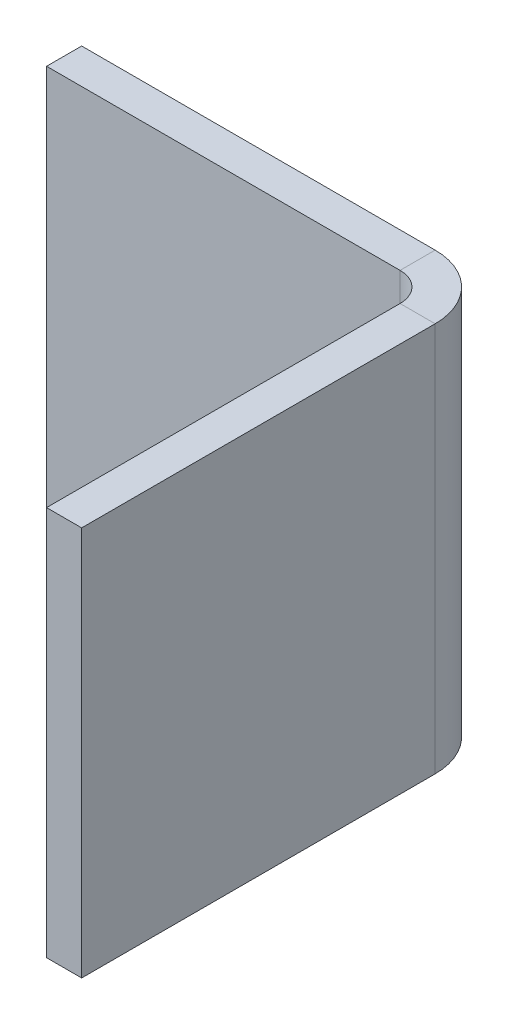
ISO-10303-21;
HEADER;
FILE_DESCRIPTION(('STEP AP214'),'2;1');
FILE_NAME('part.step','',(''),(''),'','','');
FILE_SCHEMA(('AUTOMOTIVE_DESIGN { 1 0 10303 214 1 1 1 1 }'));
ENDSEC;
DATA;
#1=APPLICATION_CONTEXT('core data for automotive mechanical design processes');
#2=APPLICATION_PROTOCOL_DEFINITION('international standard','automotive_design',2000,#1);
#3=PRODUCT_CONTEXT('',#1,'mechanical');
#4=PRODUCT('Part','Part','',(#3));
#5=PRODUCT_RELATED_PRODUCT_CATEGORY('part','',(#4));
#6=PRODUCT_DEFINITION_FORMATION('','',#4);
#7=PRODUCT_DEFINITION_CONTEXT('part definition',#1,'design');
#8=PRODUCT_DEFINITION('design','',#6,#7);
#9=PRODUCT_DEFINITION_SHAPE('','',#8);
#10=(LENGTH_UNIT() NAMED_UNIT(*) SI_UNIT(.MILLI.,.METRE.));
#11=(NAMED_UNIT(*) PLANE_ANGLE_UNIT() SI_UNIT($,.RADIAN.));
#12=(NAMED_UNIT(*) SI_UNIT($,.STERADIAN.) SOLID_ANGLE_UNIT());
#13=UNCERTAINTY_MEASURE_WITH_UNIT(LENGTH_MEASURE(1.E-05),#10,'distance_accuracy_value','');
#14=(GEOMETRIC_REPRESENTATION_CONTEXT(3) GLOBAL_UNCERTAINTY_ASSIGNED_CONTEXT((#13)) GLOBAL_UNIT_ASSIGNED_CONTEXT((#10,
#11,#12)) REPRESENTATION_CONTEXT('',''));
#15=CARTESIAN_POINT('',(0.,0.,0.));
#16=DIRECTION('',(0.,0.,1.));
#17=DIRECTION('',(1.,0.,0.));
#18=AXIS2_PLACEMENT_3D('',#15,#16,#17);
#19=CARTESIAN_POINT('',(3.64456070240273,0.,-2.68526762377754));
#20=DIRECTION('',(-1.,0.,0.));
#21=DIRECTION('',(0.,0.,1.));
#22=AXIS2_PLACEMENT_3D('',#19,#20,#21);
#23=PLANE('',#22);
#24=DIRECTION('',(0.,0.,1.));
#25=VECTOR('',#24,1.);
#26=CARTESIAN_POINT('',(3.64456070240275,-4.93562231759657,-9.74535346068741));
#27=LINE('',#26,#25);
#28=CARTESIAN_POINT('',(3.64456070240271,-4.93562231759657,1.18660000000001));
#29=VERTEX_POINT('',#28);
#30=CARTESIAN_POINT('',(3.64456070240268,-4.93562231759657,10.2546465393126));
#31=VERTEX_POINT('',#30);
#32=EDGE_CURVE('E47',#29,#31,#27,.T.);
#33=ORIENTED_EDGE('',*,*,#32,.F.);
#34=DIRECTION('',(0.,1.,0.));
#35=VECTOR('',#34,1.);
#36=CARTESIAN_POINT('',(3.64456070240271,0.,1.18660000000001));
#37=LINE('',#36,#35);
#38=CARTESIAN_POINT('',(3.64456070240271,5.06437768240343,1.18660000000001));
#39=VERTEX_POINT('',#38);
#40=EDGE_CURVE('E134',#29,#39,#37,.T.);
#41=ORIENTED_EDGE('',*,*,#40,.T.);
#42=DIRECTION('',(0.,0.,-1.));
#43=VECTOR('',#42,1.);
#44=CARTESIAN_POINT('',(3.64456070240275,5.06437768240343,-9.74535346068741));
#45=LINE('',#44,#43);
#46=CARTESIAN_POINT('',(3.64456070240268,5.06437768240343,10.2546465393126));
#47=VERTEX_POINT('',#46);
#48=EDGE_CURVE('E158',#47,#39,#45,.T.);
#49=ORIENTED_EDGE('',*,*,#48,.F.);
#50=DIRECTION('',(0.,1.,0.));
#51=VECTOR('',#50,1.);
#52=CARTESIAN_POINT('',(3.64456070240268,5.06437768240343,10.2546465393126));
#53=LINE('',#52,#51);
#54=EDGE_CURVE('E155',#31,#47,#53,.T.);
#55=ORIENTED_EDGE('',*,*,#54,.F.);
#56=EDGE_LOOP('',(#33,#41,#49,#55));
#57=FACE_BOUND('',#56,.T.);
#58=ADVANCED_FACE('F43',(#57),#23,.F.);
#59=CARTESIAN_POINT('',(3.64456070240275,5.06437768240343,-9.74535346068741));
#60=DIRECTION('',(0.,1.,0.));
#61=DIRECTION('',(-1.,0.,0.));
#62=AXIS2_PLACEMENT_3D('',#59,#60,#61);
#63=PLANE('',#62);
#64=DIRECTION('',(1.,0.,0.));
#65=VECTOR('',#64,1.);
#66=CARTESIAN_POINT('',(3.64456070240271,5.06437768240343,1.18660000000001));
#67=LINE('',#66,#65);
#68=CARTESIAN_POINT('',(2.74456070240271,5.06437768240343,1.1866));
#69=VERTEX_POINT('',#68);
#70=EDGE_CURVE('E12',#69,#39,#67,.T.);
#71=ORIENTED_EDGE('',*,*,#70,.F.);
#72=DIRECTION('',(0.,0.,-1.));
#73=VECTOR('',#72,1.);
#74=CARTESIAN_POINT('',(2.74456070240275,5.06437768240343,-9.74535346068741));
#75=LINE('',#74,#73);
#76=CARTESIAN_POINT('',(2.74456070240268,5.06437768240343,10.2546465393126));
#77=VERTEX_POINT('',#76);
#78=EDGE_CURVE('E60',#77,#69,#75,.T.);
#79=ORIENTED_EDGE('',*,*,#78,.F.);
#80=DIRECTION('',(-1.,0.,0.));
#81=VECTOR('',#80,1.);
#82=CARTESIAN_POINT('',(3.64456070240268,5.06437768240343,10.2546465393126));
#83=LINE('',#82,#81);
#84=EDGE_CURVE('E161',#47,#77,#83,.T.);
#85=ORIENTED_EDGE('',*,*,#84,.F.);
#86=ORIENTED_EDGE('',*,*,#48,.T.);
#87=EDGE_LOOP('',(#71,#79,#85,#86));
#88=FACE_BOUND('',#87,.T.);
#89=ADVANCED_FACE('F45',(#88),#63,.T.);
#90=CARTESIAN_POINT('',(3.64456070240268,5.06437768240343,10.2546465393126));
#91=DIRECTION('',(0.,0.,1.));
#92=DIRECTION('',(1.,0.,0.));
#93=AXIS2_PLACEMENT_3D('',#90,#91,#92);
#94=PLANE('',#93);
#95=DIRECTION('',(0.,1.,0.));
#96=VECTOR('',#95,1.);
#97=CARTESIAN_POINT('',(2.74456070240268,5.06437768240343,10.2546465393126));
#98=LINE('',#97,#96);
#99=CARTESIAN_POINT('',(2.74456070240268,-4.93562231759657,10.2546465393126));
#100=VERTEX_POINT('',#99);
#101=EDGE_CURVE('E159',#100,#77,#98,.T.);
#102=ORIENTED_EDGE('',*,*,#101,.F.);
#103=DIRECTION('',(-1.,0.,0.));
#104=VECTOR('',#103,1.);
#105=CARTESIAN_POINT('',(3.64456070240268,-4.93562231759657,10.2546465393126));
#106=LINE('',#105,#104);
#107=EDGE_CURVE('E163',#31,#100,#106,.T.);
#108=ORIENTED_EDGE('',*,*,#107,.F.);
#109=ORIENTED_EDGE('',*,*,#54,.T.);
#110=ORIENTED_EDGE('',*,*,#84,.T.);
#111=EDGE_LOOP('',(#102,#108,#109,#110));
#112=FACE_BOUND('',#111,.T.);
#113=ADVANCED_FACE('F212',(#112),#94,.T.);
#114=CARTESIAN_POINT('',(3.64456070240275,-4.93562231759657,-9.74535346068741));
#115=DIRECTION('',(0.,-1.,0.));
#116=DIRECTION('',(1.,0.,0.));
#117=AXIS2_PLACEMENT_3D('',#114,#115,#116);
#118=PLANE('',#117);
#119=DIRECTION('',(-1.,0.,0.));
#120=VECTOR('',#119,1.);
#121=CARTESIAN_POINT('',(3.64456070240271,-4.93562231759657,1.18660000000001));
#122=LINE('',#121,#120);
#123=CARTESIAN_POINT('',(2.74456070240271,-4.93562231759657,1.1866));
#124=VERTEX_POINT('',#123);
#125=EDGE_CURVE('E166',#29,#124,#122,.T.);
#126=ORIENTED_EDGE('',*,*,#125,.F.);
#127=ORIENTED_EDGE('',*,*,#32,.T.);
#128=ORIENTED_EDGE('',*,*,#107,.T.);
#129=DIRECTION('',(0.,0.,1.));
#130=VECTOR('',#129,1.);
#131=CARTESIAN_POINT('',(2.74456070240275,-4.93562231759657,-9.74535346068741));
#132=LINE('',#131,#130);
#133=EDGE_CURVE('E68',#124,#100,#132,.T.);
#134=ORIENTED_EDGE('',*,*,#133,.F.);
#135=EDGE_LOOP('',(#126,#127,#128,#134));
#136=FACE_BOUND('',#135,.T.);
#137=ADVANCED_FACE('F204',(#136),#118,.T.);
#138=CARTESIAN_POINT('',(2.74456070240273,0.,-2.68526762377754));
#139=DIRECTION('',(-1.,0.,0.));
#140=DIRECTION('',(0.,0.,1.));
#141=AXIS2_PLACEMENT_3D('',#138,#139,#140);
#142=PLANE('',#141);
#143=DIRECTION('',(0.,1.,0.));
#144=VECTOR('',#143,1.);
#145=CARTESIAN_POINT('',(2.74456070240271,0.,1.1866));
#146=LINE('',#145,#144);
#147=EDGE_CURVE('E52',#124,#69,#146,.T.);
#148=ORIENTED_EDGE('',*,*,#147,.F.);
#149=ORIENTED_EDGE('',*,*,#133,.T.);
#150=ORIENTED_EDGE('',*,*,#101,.T.);
#151=ORIENTED_EDGE('',*,*,#78,.T.);
#152=EDGE_LOOP('',(#148,#149,#150,#151));
#153=FACE_BOUND('',#152,.T.);
#154=ADVANCED_FACE('F197',(#153),#142,.T.);
#155=CARTESIAN_POINT('',(-7.06008583690987,5.06437768240343,-0.45));
#156=DIRECTION('',(-1.,0.,0.));
#157=DIRECTION('',(0.,0.,1.));
#158=AXIS2_PLACEMENT_3D('',#155,#156,#157);
#159=PLANE('',#158);
#160=DIRECTION('',(0.,-1.,0.));
#161=VECTOR('',#160,1.);
#162=CARTESIAN_POINT('',(-7.06008583690987,5.06437768240343,0.45));
#163=LINE('',#162,#161);
#164=CARTESIAN_POINT('',(-7.06008583690987,5.06437768240343,0.45));
#165=VERTEX_POINT('',#164);
#166=CARTESIAN_POINT('',(-7.06008583690987,-4.93562231759657,0.45));
#167=VERTEX_POINT('',#166);
#168=EDGE_CURVE('E184',#165,#167,#163,.T.);
#169=ORIENTED_EDGE('',*,*,#168,.F.);
#170=DIRECTION('',(0.,0.,1.));
#171=VECTOR('',#170,1.);
#172=CARTESIAN_POINT('',(-7.06008583690987,5.06437768240343,-0.45));
#173=LINE('',#172,#171);
#174=CARTESIAN_POINT('',(-7.06008583690987,5.06437768240343,-0.45));
#175=VERTEX_POINT('',#174);
#176=EDGE_CURVE('E171',#175,#165,#173,.T.);
#177=ORIENTED_EDGE('',*,*,#176,.F.);
#178=DIRECTION('',(0.,-1.,0.));
#179=VECTOR('',#178,1.);
#180=CARTESIAN_POINT('',(-7.06008583690987,5.06437768240343,-0.45));
#181=LINE('',#180,#179);
#182=CARTESIAN_POINT('',(-7.06008583690987,-4.93562231759657,-0.45));
#183=VERTEX_POINT('',#182);
#184=EDGE_CURVE('E146',#175,#183,#181,.T.);
#185=ORIENTED_EDGE('',*,*,#184,.T.);
#186=DIRECTION('',(0.,0.,1.));
#187=VECTOR('',#186,1.);
#188=CARTESIAN_POINT('',(-7.06008583690987,-4.93562231759657,-0.45));
#189=LINE('',#188,#187);
#190=EDGE_CURVE('E149',#183,#167,#189,.T.);
#191=ORIENTED_EDGE('',*,*,#190,.T.);
#192=EDGE_LOOP('',(#169,#177,#185,#191));
#193=FACE_BOUND('',#192,.T.);
#194=ADVANCED_FACE('F195',(#193),#159,.T.);
#195=CARTESIAN_POINT('',(0.,0.,-0.45));
#196=DIRECTION('',(0.,0.,1.));
#197=DIRECTION('',(1.,0.,0.));
#198=AXIS2_PLACEMENT_3D('',#195,#196,#197);
#199=PLANE('',#198);
#200=DIRECTION('',(0.,1.,0.));
#201=VECTOR('',#200,1.);
#202=CARTESIAN_POINT('',(2.00796070240271,0.,-0.45));
#203=LINE('',#202,#201);
#204=CARTESIAN_POINT('',(2.00796070240271,-4.93562231759657,-0.45));
#205=VERTEX_POINT('',#204);
#206=CARTESIAN_POINT('',(2.00796070240271,5.06437768240343,-0.45));
#207=VERTEX_POINT('',#206);
#208=EDGE_CURVE('E131',#205,#207,#203,.T.);
#209=ORIENTED_EDGE('',*,*,#208,.F.);
#210=DIRECTION('',(1.,0.,0.));
#211=VECTOR('',#210,1.);
#212=CARTESIAN_POINT('',(-7.06008583690987,-4.93562231759657,-0.45));
#213=LINE('',#212,#211);
#214=EDGE_CURVE('E125',#183,#205,#213,.T.);
#215=ORIENTED_EDGE('',*,*,#214,.F.);
#216=ORIENTED_EDGE('',*,*,#184,.F.);
#217=DIRECTION('',(-1.,0.,0.));
#218=VECTOR('',#217,1.);
#219=CARTESIAN_POINT('',(-7.06008583690987,5.06437768240343,-0.45));
#220=LINE('',#219,#218);
#221=EDGE_CURVE('E144',#207,#175,#220,.T.);
#222=ORIENTED_EDGE('',*,*,#221,.F.);
#223=EDGE_LOOP('',(#209,#215,#216,#222));
#224=FACE_BOUND('',#223,.T.);
#225=ADVANCED_FACE('F141',(#224),#199,.F.);
#226=CARTESIAN_POINT('',(-7.06008583690987,-4.93562231759657,-0.45));
#227=DIRECTION('',(0.,-1.,0.));
#228=DIRECTION('',(0.,0.,-1.));
#229=AXIS2_PLACEMENT_3D('',#226,#227,#228);
#230=PLANE('',#229);
#231=ORIENTED_EDGE('',*,*,#214,.T.);
#232=DIRECTION('',(0.,0.,1.));
#233=VECTOR('',#232,1.);
#234=CARTESIAN_POINT('',(2.00796070240271,-4.93562231759657,-0.45));
#235=LINE('',#234,#233);
#236=CARTESIAN_POINT('',(2.00796070240271,-4.93562231759657,0.45));
#237=VERTEX_POINT('',#236);
#238=EDGE_CURVE('E112',#205,#237,#235,.T.);
#239=ORIENTED_EDGE('',*,*,#238,.T.);
#240=DIRECTION('',(1.,0.,0.));
#241=VECTOR('',#240,1.);
#242=CARTESIAN_POINT('',(-7.06008583690987,-4.93562231759657,0.45));
#243=LINE('',#242,#241);
#244=EDGE_CURVE('E124',#167,#237,#243,.T.);
#245=ORIENTED_EDGE('',*,*,#244,.F.);
#246=ORIENTED_EDGE('',*,*,#190,.F.);
#247=EDGE_LOOP('',(#231,#239,#245,#246));
#248=FACE_BOUND('',#247,.T.);
#249=ADVANCED_FACE('F148',(#248),#230,.T.);
#250=CARTESIAN_POINT('',(0.,0.,0.45));
#251=DIRECTION('',(0.,0.,1.));
#252=DIRECTION('',(1.,0.,0.));
#253=AXIS2_PLACEMENT_3D('',#250,#251,#252);
#254=PLANE('',#253);
#255=ORIENTED_EDGE('',*,*,#244,.T.);
#256=DIRECTION('',(0.,1.,0.));
#257=VECTOR('',#256,1.);
#258=CARTESIAN_POINT('',(2.00796070240271,0.,0.45));
#259=LINE('',#258,#257);
#260=CARTESIAN_POINT('',(2.00796070240271,5.06437768240343,0.45));
#261=VERTEX_POINT('',#260);
#262=EDGE_CURVE('E189',#237,#261,#259,.T.);
#263=ORIENTED_EDGE('',*,*,#262,.T.);
#264=DIRECTION('',(-1.,0.,0.));
#265=VECTOR('',#264,1.);
#266=CARTESIAN_POINT('',(-7.06008583690987,5.06437768240343,0.45));
#267=LINE('',#266,#265);
#268=EDGE_CURVE('E187',#261,#165,#267,.T.);
#269=ORIENTED_EDGE('',*,*,#268,.T.);
#270=ORIENTED_EDGE('',*,*,#168,.T.);
#271=EDGE_LOOP('',(#255,#263,#269,#270));
#272=FACE_BOUND('',#271,.T.);
#273=ADVANCED_FACE('F193',(#272),#254,.T.);
#274=CARTESIAN_POINT('',(-7.06008583690987,5.06437768240343,-0.45));
#275=DIRECTION('',(0.,1.,0.));
#276=DIRECTION('',(0.,0.,1.));
#277=AXIS2_PLACEMENT_3D('',#274,#275,#276);
#278=PLANE('',#277);
#279=ORIENTED_EDGE('',*,*,#268,.F.);
#280=DIRECTION('',(0.,0.,-1.));
#281=VECTOR('',#280,1.);
#282=CARTESIAN_POINT('',(2.00796070240271,5.06437768240343,-0.45));
#283=LINE('',#282,#281);
#284=EDGE_CURVE('E178',#261,#207,#283,.T.);
#285=ORIENTED_EDGE('',*,*,#284,.T.);
#286=ORIENTED_EDGE('',*,*,#221,.T.);
#287=ORIENTED_EDGE('',*,*,#176,.T.);
#288=EDGE_LOOP('',(#279,#285,#286,#287));
#289=FACE_BOUND('',#288,.T.);
#290=ADVANCED_FACE('F233',(#289),#278,.T.);
#291=CARTESIAN_POINT('',(2.00796070240271,-4.93562231759657,1.1866));
#292=DIRECTION('',(0.,-1.,0.));
#293=DIRECTION('',(0.,0.,-1.));
#294=AXIS2_PLACEMENT_3D('',#291,#292,#293);
#295=PLANE('',#294);
#296=ORIENTED_EDGE('',*,*,#125,.T.);
#297=CARTESIAN_POINT('',(2.00796070240271,-4.93562231759657,1.1866));
#298=DIRECTION('',(0.,-1.,0.));
#299=DIRECTION('',(0.,0.,-1.));
#300=AXIS2_PLACEMENT_3D('',#297,#298,#299);
#301=CIRCLE('',#300,0.7366);
#302=EDGE_CURVE('E119',#124,#237,#301,.F.);
#303=ORIENTED_EDGE('',*,*,#302,.T.);
#304=ORIENTED_EDGE('',*,*,#238,.F.);
#305=CARTESIAN_POINT('',(2.00796070240271,-4.93562231759657,1.1866));
#306=DIRECTION('',(0.,1.,0.));
#307=DIRECTION('',(0.,0.,-1.));
#308=AXIS2_PLACEMENT_3D('',#305,#306,#307);
#309=CIRCLE('',#308,1.6366);
#310=EDGE_CURVE('E116',#29,#205,#309,.T.);
#311=ORIENTED_EDGE('',*,*,#310,.F.);
#312=EDGE_LOOP('',(#296,#303,#304,#311));
#313=FACE_BOUND('',#312,.T.);
#314=ADVANCED_FACE('F115',(#313),#295,.T.);
#315=CARTESIAN_POINT('',(2.00796070240271,5.06437768240343,1.1866));
#316=DIRECTION('',(0.,1.,0.));
#317=DIRECTION('',(0.,0.,1.));
#318=AXIS2_PLACEMENT_3D('',#315,#316,#317);
#319=PLANE('',#318);
#320=ORIENTED_EDGE('',*,*,#284,.F.);
#321=CARTESIAN_POINT('',(2.00796070240271,5.06437768240343,1.1866));
#322=DIRECTION('',(0.,-1.,0.));
#323=DIRECTION('',(0.,0.,-1.));
#324=AXIS2_PLACEMENT_3D('',#321,#322,#323);
#325=CIRCLE('',#324,0.7366);
#326=EDGE_CURVE('E136',#261,#69,#325,.T.);
#327=ORIENTED_EDGE('',*,*,#326,.T.);
#328=ORIENTED_EDGE('',*,*,#70,.T.);
#329=CARTESIAN_POINT('',(2.00796070240271,5.06437768240343,1.1866));
#330=DIRECTION('',(0.,-1.,0.));
#331=DIRECTION('',(0.,0.,1.));
#332=AXIS2_PLACEMENT_3D('',#329,#330,#331);
#333=CIRCLE('',#332,1.6366);
#334=EDGE_CURVE('E135',#207,#39,#333,.T.);
#335=ORIENTED_EDGE('',*,*,#334,.F.);
#336=EDGE_LOOP('',(#320,#327,#328,#335));
#337=FACE_BOUND('',#336,.T.);
#338=ADVANCED_FACE('F229',(#337),#319,.T.);
#339=CARTESIAN_POINT('',(2.00796070240271,10.2763387581004,1.1866));
#340=DIRECTION('',(0.,-1.,0.));
#341=DIRECTION('',(0.,0.,-1.));
#342=AXIS2_PLACEMENT_3D('',#339,#340,#341);
#343=CYLINDRICAL_SURFACE('',#342,1.6366);
#344=ORIENTED_EDGE('',*,*,#334,.T.);
#345=ORIENTED_EDGE('',*,*,#40,.F.);
#346=ORIENTED_EDGE('',*,*,#310,.T.);
#347=ORIENTED_EDGE('',*,*,#208,.T.);
#348=EDGE_LOOP('',(#344,#345,#346,#347));
#349=FACE_BOUND('',#348,.T.);
#350=ADVANCED_FACE('F130',(#349),#343,.T.);
#351=CARTESIAN_POINT('',(2.00796070240271,10.2763387581004,1.1866));
#352=DIRECTION('',(0.,-1.,0.));
#353=DIRECTION('',(0.,0.,-1.));
#354=AXIS2_PLACEMENT_3D('',#351,#352,#353);
#355=CYLINDRICAL_SURFACE('',#354,0.7366);
#356=ORIENTED_EDGE('',*,*,#326,.F.);
#357=ORIENTED_EDGE('',*,*,#262,.F.);
#358=ORIENTED_EDGE('',*,*,#302,.F.);
#359=ORIENTED_EDGE('',*,*,#147,.T.);
#360=EDGE_LOOP('',(#356,#357,#358,#359));
#361=FACE_BOUND('',#360,.T.);
#362=ADVANCED_FACE('F225',(#361),#355,.F.);
#363=CLOSED_SHELL('',(#58,#89,#113,#137,#154,#194,#225,#249,#273,#290,#314,#338,#350,#362));
#364=MANIFOLD_SOLID_BREP('B2',#363);
#365=ADVANCED_BREP_SHAPE_REPRESENTATION('',(#18,#364),#14);
#366=SHAPE_DEFINITION_REPRESENTATION(#9,#365);
ENDSEC;
END-ISO-10303-21;
